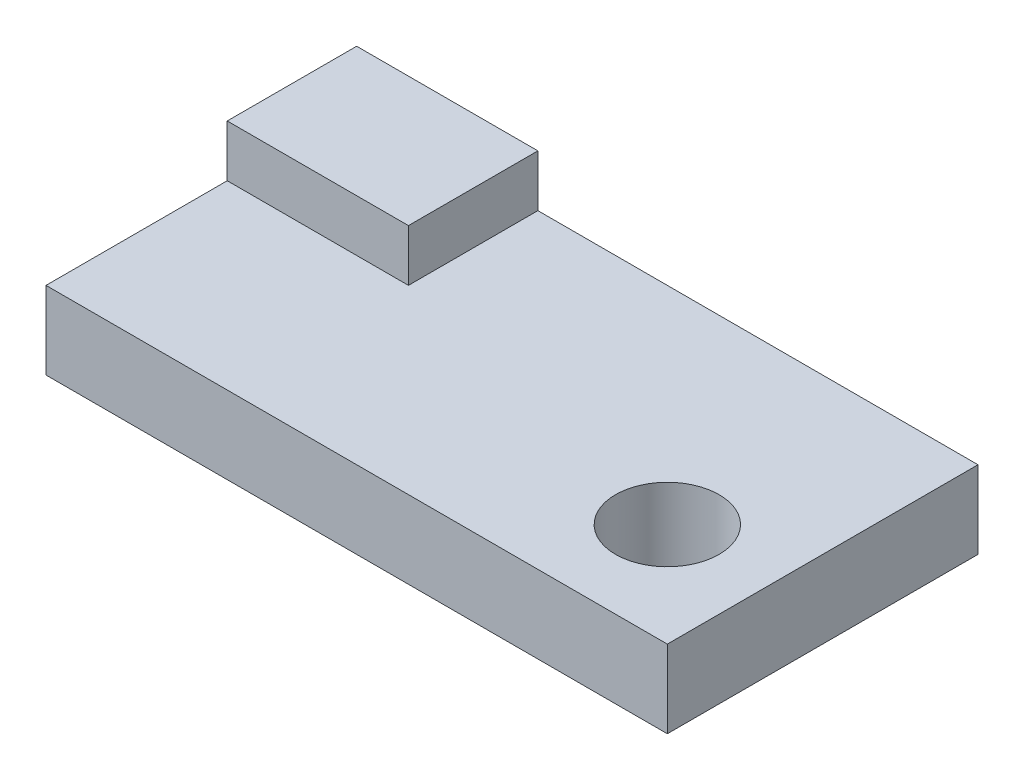
ISO-10303-21;
HEADER;
FILE_DESCRIPTION(('STEP AP214'),'2;1');
FILE_NAME('part.step','',(''),(''),'','','');
FILE_SCHEMA(('AUTOMOTIVE_DESIGN { 1 0 10303 214 1 1 1 1 }'));
ENDSEC;
DATA;
#1=APPLICATION_CONTEXT('core data for automotive mechanical design processes');
#2=APPLICATION_PROTOCOL_DEFINITION('international standard','automotive_design',2000,#1);
#3=PRODUCT_CONTEXT('',#1,'mechanical');
#4=PRODUCT('Part','Part','',(#3));
#5=PRODUCT_RELATED_PRODUCT_CATEGORY('part','',(#4));
#6=PRODUCT_DEFINITION_FORMATION('','',#4);
#7=PRODUCT_DEFINITION_CONTEXT('part definition',#1,'design');
#8=PRODUCT_DEFINITION('design','',#6,#7);
#9=PRODUCT_DEFINITION_SHAPE('','',#8);
#10=(LENGTH_UNIT() NAMED_UNIT(*) SI_UNIT(.MILLI.,.METRE.));
#11=(NAMED_UNIT(*) PLANE_ANGLE_UNIT() SI_UNIT($,.RADIAN.));
#12=(NAMED_UNIT(*) SI_UNIT($,.STERADIAN.) SOLID_ANGLE_UNIT());
#13=UNCERTAINTY_MEASURE_WITH_UNIT(LENGTH_MEASURE(1.E-05),#10,'distance_accuracy_value','');
#14=(GEOMETRIC_REPRESENTATION_CONTEXT(3) GLOBAL_UNCERTAINTY_ASSIGNED_CONTEXT((#13)) GLOBAL_UNIT_ASSIGNED_CONTEXT((#10,
#11,#12)) REPRESENTATION_CONTEXT('',''));
#15=CARTESIAN_POINT('',(0.,0.,0.));
#16=DIRECTION('',(0.,0.,1.));
#17=DIRECTION('',(1.,0.,0.));
#18=AXIS2_PLACEMENT_3D('',#15,#16,#17);
#19=CARTESIAN_POINT('',(0.,15.,0.));
#20=DIRECTION('',(0.,1.,0.));
#21=DIRECTION('',(0.,0.,1.));
#22=AXIS2_PLACEMENT_3D('',#19,#20,#21);
#23=PLANE('',#22);
#24=DIRECTION('',(0.,0.,-1.));
#25=VECTOR('',#24,1.);
#26=CARTESIAN_POINT('',(-25.,15.,-30.));
#27=LINE('',#26,#25);
#28=CARTESIAN_POINT('',(-25.,15.,-5.));
#29=VERTEX_POINT('',#28);
#30=CARTESIAN_POINT('',(-25.,15.,-30.));
#31=VERTEX_POINT('',#30);
#32=EDGE_CURVE('E114',#29,#31,#27,.T.);
#33=ORIENTED_EDGE('',*,*,#32,.F.);
#34=DIRECTION('',(1.,0.,0.));
#35=VECTOR('',#34,1.);
#36=CARTESIAN_POINT('',(-60.,15.,-5.));
#37=LINE('',#36,#35);
#38=CARTESIAN_POINT('',(-60.,15.,-5.));
#39=VERTEX_POINT('',#38);
#40=EDGE_CURVE('E58',#39,#29,#37,.T.);
#41=ORIENTED_EDGE('',*,*,#40,.F.);
#42=DIRECTION('',(0.,0.,1.));
#43=VECTOR('',#42,1.);
#44=CARTESIAN_POINT('',(-60.,15.,-30.));
#45=LINE('',#44,#43);
#46=CARTESIAN_POINT('',(-60.,15.,30.));
#47=VERTEX_POINT('',#46);
#48=EDGE_CURVE('E118',#39,#47,#45,.T.);
#49=ORIENTED_EDGE('',*,*,#48,.T.);
#50=DIRECTION('',(1.,0.,0.));
#51=VECTOR('',#50,1.);
#52=CARTESIAN_POINT('',(-60.,15.,30.));
#53=LINE('',#52,#51);
#54=CARTESIAN_POINT('',(60.,15.,30.));
#55=VERTEX_POINT('',#54);
#56=EDGE_CURVE('E132',#47,#55,#53,.T.);
#57=ORIENTED_EDGE('',*,*,#56,.T.);
#58=DIRECTION('',(0.,0.,-1.));
#59=VECTOR('',#58,1.);
#60=CARTESIAN_POINT('',(60.,15.,-30.));
#61=LINE('',#60,#59);
#62=CARTESIAN_POINT('',(60.,15.,-30.));
#63=VERTEX_POINT('',#62);
#64=EDGE_CURVE('E135',#55,#63,#61,.T.);
#65=ORIENTED_EDGE('',*,*,#64,.T.);
#66=DIRECTION('',(-1.,0.,0.));
#67=VECTOR('',#66,1.);
#68=CARTESIAN_POINT('',(-60.,15.,-30.));
#69=LINE('',#68,#67);
#70=EDGE_CURVE('E52',#63,#31,#69,.T.);
#71=ORIENTED_EDGE('',*,*,#70,.T.);
#72=EDGE_LOOP('',(#33,#41,#49,#57,#65,#71));
#73=FACE_BOUND('',#72,.T.);
#74=CARTESIAN_POINT('',(40.,15.,10.));
#75=DIRECTION('',(0.,1.,0.));
#76=DIRECTION('',(0.,0.,1.));
#77=AXIS2_PLACEMENT_3D('',#74,#75,#76);
#78=CIRCLE('',#77,10.);
#79=CARTESIAN_POINT('',(40.,15.,20.));
#80=VERTEX_POINT('',#79);
#81=EDGE_CURVE('E122',#80,#80,#78,.T.);
#82=ORIENTED_EDGE('',*,*,#81,.F.);
#83=EDGE_LOOP('',(#82));
#84=FACE_BOUND('',#83,.T.);
#85=ADVANCED_FACE('F37',(#73,#84),#23,.T.);
#86=CARTESIAN_POINT('',(0.,0.,0.));
#87=DIRECTION('',(0.,1.,0.));
#88=DIRECTION('',(0.,0.,1.));
#89=AXIS2_PLACEMENT_3D('',#86,#87,#88);
#90=PLANE('',#89);
#91=DIRECTION('',(0.,0.,1.));
#92=VECTOR('',#91,1.);
#93=CARTESIAN_POINT('',(-60.,0.,-30.));
#94=LINE('',#93,#92);
#95=CARTESIAN_POINT('',(-60.,0.,-30.));
#96=VERTEX_POINT('',#95);
#97=CARTESIAN_POINT('',(-60.,0.,30.));
#98=VERTEX_POINT('',#97);
#99=EDGE_CURVE('E129',#96,#98,#94,.T.);
#100=ORIENTED_EDGE('',*,*,#99,.F.);
#101=DIRECTION('',(-1.,0.,0.));
#102=VECTOR('',#101,1.);
#103=CARTESIAN_POINT('',(-60.,0.,-30.));
#104=LINE('',#103,#102);
#105=CARTESIAN_POINT('',(60.,0.,-30.));
#106=VERTEX_POINT('',#105);
#107=EDGE_CURVE('E133',#106,#96,#104,.T.);
#108=ORIENTED_EDGE('',*,*,#107,.F.);
#109=DIRECTION('',(0.,0.,-1.));
#110=VECTOR('',#109,1.);
#111=CARTESIAN_POINT('',(60.,0.,-30.));
#112=LINE('',#111,#110);
#113=CARTESIAN_POINT('',(60.,0.,30.));
#114=VERTEX_POINT('',#113);
#115=EDGE_CURVE('E142',#114,#106,#112,.T.);
#116=ORIENTED_EDGE('',*,*,#115,.F.);
#117=DIRECTION('',(1.,0.,0.));
#118=VECTOR('',#117,1.);
#119=CARTESIAN_POINT('',(-60.,0.,30.));
#120=LINE('',#119,#118);
#121=EDGE_CURVE('E140',#98,#114,#120,.T.);
#122=ORIENTED_EDGE('',*,*,#121,.F.);
#123=EDGE_LOOP('',(#100,#108,#116,#122));
#124=FACE_BOUND('',#123,.T.);
#125=CARTESIAN_POINT('',(40.,0.,10.));
#126=DIRECTION('',(0.,1.,0.));
#127=DIRECTION('',(0.,0.,1.));
#128=AXIS2_PLACEMENT_3D('',#125,#126,#127);
#129=CIRCLE('',#128,10.);
#130=CARTESIAN_POINT('',(40.,0.,20.));
#131=VERTEX_POINT('',#130);
#132=EDGE_CURVE('E119',#131,#131,#129,.T.);
#133=ORIENTED_EDGE('',*,*,#132,.T.);
#134=EDGE_LOOP('',(#133));
#135=FACE_BOUND('',#134,.T.);
#136=ADVANCED_FACE('F160',(#124,#135),#90,.F.);
#137=CARTESIAN_POINT('',(-60.,15.,-30.));
#138=DIRECTION('',(1.,0.,0.));
#139=DIRECTION('',(0.,0.,-1.));
#140=AXIS2_PLACEMENT_3D('',#137,#138,#139);
#141=PLANE('',#140);
#142=ORIENTED_EDGE('',*,*,#99,.T.);
#143=DIRECTION('',(0.,-1.,0.));
#144=VECTOR('',#143,1.);
#145=CARTESIAN_POINT('',(-60.,15.,30.));
#146=LINE('',#145,#144);
#147=EDGE_CURVE('E11',#47,#98,#146,.T.);
#148=ORIENTED_EDGE('',*,*,#147,.F.);
#149=ORIENTED_EDGE('',*,*,#48,.F.);
#150=DIRECTION('',(0.,-1.,0.));
#151=VECTOR('',#150,1.);
#152=CARTESIAN_POINT('',(-60.,25.,-5.));
#153=LINE('',#152,#151);
#154=CARTESIAN_POINT('',(-60.,25.,-5.));
#155=VERTEX_POINT('',#154);
#156=EDGE_CURVE('E99',#155,#39,#153,.T.);
#157=ORIENTED_EDGE('',*,*,#156,.F.);
#158=DIRECTION('',(0.,0.,1.));
#159=VECTOR('',#158,1.);
#160=CARTESIAN_POINT('',(-60.,25.,-30.));
#161=LINE('',#160,#159);
#162=CARTESIAN_POINT('',(-60.,25.,-30.));
#163=VERTEX_POINT('',#162);
#164=EDGE_CURVE('E105',#163,#155,#161,.T.);
#165=ORIENTED_EDGE('',*,*,#164,.F.);
#166=DIRECTION('',(0.,-1.,0.));
#167=VECTOR('',#166,1.);
#168=CARTESIAN_POINT('',(-60.,15.,-30.));
#169=LINE('',#168,#167);
#170=EDGE_CURVE('E138',#163,#96,#169,.T.);
#171=ORIENTED_EDGE('',*,*,#170,.T.);
#172=EDGE_LOOP('',(#142,#148,#149,#157,#165,#171));
#173=FACE_BOUND('',#172,.T.);
#174=ADVANCED_FACE('F39',(#173),#141,.F.);
#175=CARTESIAN_POINT('',(-60.,15.,30.));
#176=DIRECTION('',(0.,0.,-1.));
#177=DIRECTION('',(-1.,0.,0.));
#178=AXIS2_PLACEMENT_3D('',#175,#176,#177);
#179=PLANE('',#178);
#180=ORIENTED_EDGE('',*,*,#121,.T.);
#181=DIRECTION('',(0.,-1.,0.));
#182=VECTOR('',#181,1.);
#183=CARTESIAN_POINT('',(60.,15.,30.));
#184=LINE('',#183,#182);
#185=EDGE_CURVE('E45',#55,#114,#184,.T.);
#186=ORIENTED_EDGE('',*,*,#185,.F.);
#187=ORIENTED_EDGE('',*,*,#56,.F.);
#188=ORIENTED_EDGE('',*,*,#147,.T.);
#189=EDGE_LOOP('',(#180,#186,#187,#188));
#190=FACE_BOUND('',#189,.T.);
#191=ADVANCED_FACE('F164',(#190),#179,.F.);
#192=CARTESIAN_POINT('',(60.,15.,-30.));
#193=DIRECTION('',(-1.,0.,0.));
#194=DIRECTION('',(0.,0.,1.));
#195=AXIS2_PLACEMENT_3D('',#192,#193,#194);
#196=PLANE('',#195);
#197=ORIENTED_EDGE('',*,*,#115,.T.);
#198=DIRECTION('',(0.,-1.,0.));
#199=VECTOR('',#198,1.);
#200=CARTESIAN_POINT('',(60.,15.,-30.));
#201=LINE('',#200,#199);
#202=EDGE_CURVE('E146',#63,#106,#201,.T.);
#203=ORIENTED_EDGE('',*,*,#202,.F.);
#204=ORIENTED_EDGE('',*,*,#64,.F.);
#205=ORIENTED_EDGE('',*,*,#185,.T.);
#206=EDGE_LOOP('',(#197,#203,#204,#205));
#207=FACE_BOUND('',#206,.T.);
#208=ADVANCED_FACE('F153',(#207),#196,.F.);
#209=CARTESIAN_POINT('',(-60.,15.,-30.));
#210=DIRECTION('',(0.,0.,1.));
#211=DIRECTION('',(1.,0.,0.));
#212=AXIS2_PLACEMENT_3D('',#209,#210,#211);
#213=PLANE('',#212);
#214=ORIENTED_EDGE('',*,*,#107,.T.);
#215=ORIENTED_EDGE('',*,*,#170,.F.);
#216=DIRECTION('',(-1.,0.,0.));
#217=VECTOR('',#216,1.);
#218=CARTESIAN_POINT('',(-60.,25.,-30.));
#219=LINE('',#218,#217);
#220=CARTESIAN_POINT('',(-25.,25.,-30.));
#221=VERTEX_POINT('',#220);
#222=EDGE_CURVE('E111',#221,#163,#219,.T.);
#223=ORIENTED_EDGE('',*,*,#222,.F.);
#224=DIRECTION('',(0.,-1.,0.));
#225=VECTOR('',#224,1.);
#226=CARTESIAN_POINT('',(-25.,25.,-30.));
#227=LINE('',#226,#225);
#228=EDGE_CURVE('E124',#221,#31,#227,.T.);
#229=ORIENTED_EDGE('',*,*,#228,.T.);
#230=ORIENTED_EDGE('',*,*,#70,.F.);
#231=ORIENTED_EDGE('',*,*,#202,.T.);
#232=EDGE_LOOP('',(#214,#215,#223,#229,#230,#231));
#233=FACE_BOUND('',#232,.T.);
#234=ADVANCED_FACE('F163',(#233),#213,.F.);
#235=CARTESIAN_POINT('',(40.,15.,10.));
#236=DIRECTION('',(0.,-1.,0.));
#237=DIRECTION('',(0.,0.,-1.));
#238=AXIS2_PLACEMENT_3D('',#235,#236,#237);
#239=CYLINDRICAL_SURFACE('',#238,10.);
#240=ORIENTED_EDGE('',*,*,#81,.T.);
#241=EDGE_LOOP('',(#240));
#242=FACE_BOUND('',#241,.T.);
#243=ORIENTED_EDGE('',*,*,#132,.F.);
#244=EDGE_LOOP('',(#243));
#245=FACE_BOUND('',#244,.T.);
#246=ADVANCED_FACE('F181',(#242,#245),#239,.F.);
#247=CARTESIAN_POINT('',(-60.,25.,-5.));
#248=DIRECTION('',(0.,0.,-1.));
#249=DIRECTION('',(-1.,0.,0.));
#250=AXIS2_PLACEMENT_3D('',#247,#248,#249);
#251=PLANE('',#250);
#252=ORIENTED_EDGE('',*,*,#40,.T.);
#253=DIRECTION('',(0.,-1.,0.));
#254=VECTOR('',#253,1.);
#255=CARTESIAN_POINT('',(-25.,25.,-5.));
#256=LINE('',#255,#254);
#257=CARTESIAN_POINT('',(-25.,25.,-5.));
#258=VERTEX_POINT('',#257);
#259=EDGE_CURVE('E101',#258,#29,#256,.T.);
#260=ORIENTED_EDGE('',*,*,#259,.F.);
#261=DIRECTION('',(1.,0.,0.));
#262=VECTOR('',#261,1.);
#263=CARTESIAN_POINT('',(-60.,25.,-5.));
#264=LINE('',#263,#262);
#265=EDGE_CURVE('E95',#155,#258,#264,.T.);
#266=ORIENTED_EDGE('',*,*,#265,.F.);
#267=ORIENTED_EDGE('',*,*,#156,.T.);
#268=EDGE_LOOP('',(#252,#260,#266,#267));
#269=FACE_BOUND('',#268,.T.);
#270=ADVANCED_FACE('F97',(#269),#251,.F.);
#271=CARTESIAN_POINT('',(-25.,25.,-30.));
#272=DIRECTION('',(-1.,0.,0.));
#273=DIRECTION('',(0.,0.,1.));
#274=AXIS2_PLACEMENT_3D('',#271,#272,#273);
#275=PLANE('',#274);
#276=ORIENTED_EDGE('',*,*,#32,.T.);
#277=ORIENTED_EDGE('',*,*,#228,.F.);
#278=DIRECTION('',(0.,0.,-1.));
#279=VECTOR('',#278,1.);
#280=CARTESIAN_POINT('',(-25.,25.,-30.));
#281=LINE('',#280,#279);
#282=EDGE_CURVE('E104',#258,#221,#281,.T.);
#283=ORIENTED_EDGE('',*,*,#282,.F.);
#284=ORIENTED_EDGE('',*,*,#259,.T.);
#285=EDGE_LOOP('',(#276,#277,#283,#284));
#286=FACE_BOUND('',#285,.T.);
#287=ADVANCED_FACE('F173',(#286),#275,.F.);
#288=CARTESIAN_POINT('',(0.,25.,0.));
#289=DIRECTION('',(0.,1.,0.));
#290=DIRECTION('',(0.,0.,1.));
#291=AXIS2_PLACEMENT_3D('',#288,#289,#290);
#292=PLANE('',#291);
#293=ORIENTED_EDGE('',*,*,#164,.T.);
#294=ORIENTED_EDGE('',*,*,#265,.T.);
#295=ORIENTED_EDGE('',*,*,#282,.T.);
#296=ORIENTED_EDGE('',*,*,#222,.T.);
#297=EDGE_LOOP('',(#293,#294,#295,#296));
#298=FACE_BOUND('',#297,.T.);
#299=ADVANCED_FACE('F109',(#298),#292,.T.);
#300=CLOSED_SHELL('',(#85,#136,#174,#191,#208,#234,#246,#270,#287,#299));
#301=MANIFOLD_SOLID_BREP('B2',#300);
#302=ADVANCED_BREP_SHAPE_REPRESENTATION('',(#18,#301),#14);
#303=SHAPE_DEFINITION_REPRESENTATION(#9,#302);
ENDSEC;
END-ISO-10303-21;
